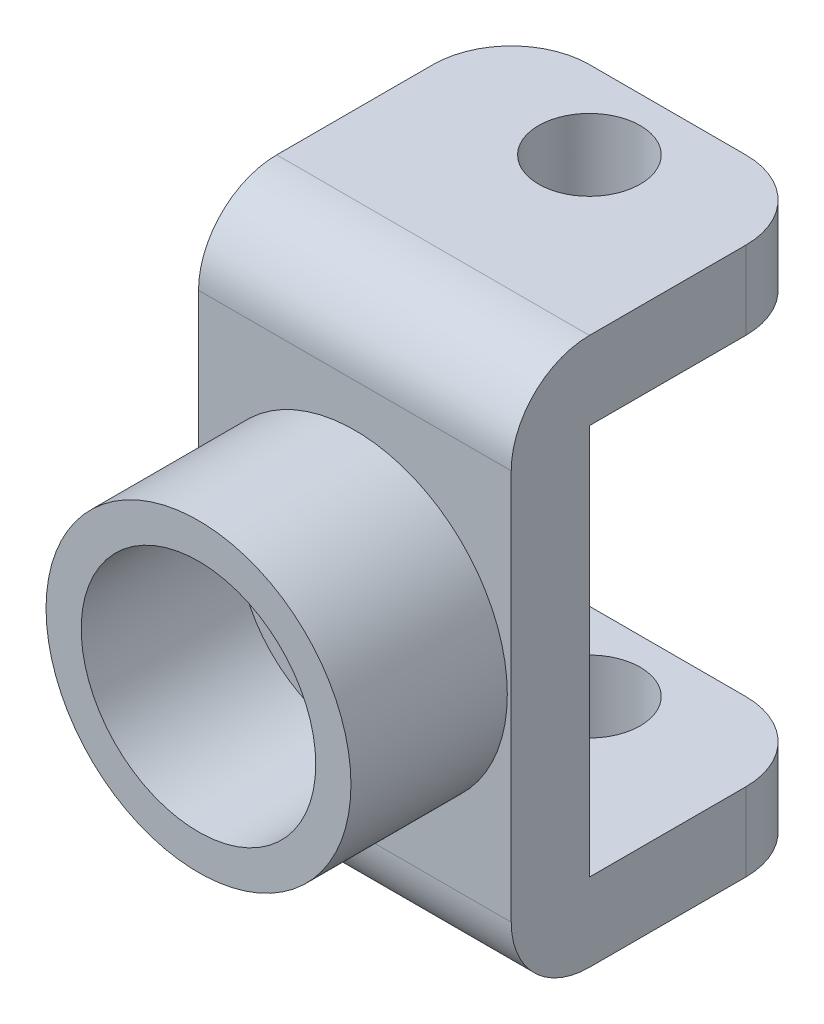
ISO-10303-21;
HEADER;
FILE_DESCRIPTION(('STEP AP214'),'2;1');
FILE_NAME('part.step','',(''),(''),'','','');
FILE_SCHEMA(('AUTOMOTIVE_DESIGN { 1 0 10303 214 1 1 1 1 }'));
ENDSEC;
DATA;
#1=APPLICATION_CONTEXT('core data for automotive mechanical design processes');
#2=APPLICATION_PROTOCOL_DEFINITION('international standard','automotive_design',2000,#1);
#3=PRODUCT_CONTEXT('',#1,'mechanical');
#4=PRODUCT('Part','Part','',(#3));
#5=PRODUCT_RELATED_PRODUCT_CATEGORY('part','',(#4));
#6=PRODUCT_DEFINITION_FORMATION('','',#4);
#7=PRODUCT_DEFINITION_CONTEXT('part definition',#1,'design');
#8=PRODUCT_DEFINITION('design','',#6,#7);
#9=PRODUCT_DEFINITION_SHAPE('','',#8);
#10=(LENGTH_UNIT() NAMED_UNIT(*) SI_UNIT(.MILLI.,.METRE.));
#11=(NAMED_UNIT(*) PLANE_ANGLE_UNIT() SI_UNIT($,.RADIAN.));
#12=(NAMED_UNIT(*) SI_UNIT($,.STERADIAN.) SOLID_ANGLE_UNIT());
#13=UNCERTAINTY_MEASURE_WITH_UNIT(LENGTH_MEASURE(1.E-05),#10,'distance_accuracy_value','');
#14=(GEOMETRIC_REPRESENTATION_CONTEXT(3) GLOBAL_UNCERTAINTY_ASSIGNED_CONTEXT((#13)) GLOBAL_UNIT_ASSIGNED_CONTEXT((#10,
#11,#12)) REPRESENTATION_CONTEXT('',''));
#15=CARTESIAN_POINT('',(0.,0.,0.));
#16=DIRECTION('',(0.,0.,1.));
#17=DIRECTION('',(1.,0.,0.));
#18=AXIS2_PLACEMENT_3D('',#15,#16,#17);
#19=CARTESIAN_POINT('',(0.,0.,0.));
#20=DIRECTION('',(0.,0.,1.));
#21=DIRECTION('',(1.,0.,0.));
#22=AXIS2_PLACEMENT_3D('',#19,#20,#21);
#23=PLANE('',#22);
#24=DIRECTION('',(1.,0.,0.));
#25=VECTOR('',#24,1.);
#26=CARTESIAN_POINT('',(0.,-25.,0.));
#27=LINE('',#26,#25);
#28=CARTESIAN_POINT('',(-20.,-25.,0.));
#29=VERTEX_POINT('',#28);
#30=CARTESIAN_POINT('',(20.,-25.,0.));
#31=VERTEX_POINT('',#30);
#32=EDGE_CURVE('E193',#29,#31,#27,.T.);
#33=ORIENTED_EDGE('',*,*,#32,.F.);
#34=DIRECTION('',(0.,1.,0.));
#35=VECTOR('',#34,1.);
#36=CARTESIAN_POINT('',(-20.,0.,0.));
#37=LINE('',#36,#35);
#38=CARTESIAN_POINT('',(-20.,25.,0.));
#39=VERTEX_POINT('',#38);
#40=EDGE_CURVE('E214',#29,#39,#37,.T.);
#41=ORIENTED_EDGE('',*,*,#40,.T.);
#42=DIRECTION('',(1.,0.,0.));
#43=VECTOR('',#42,1.);
#44=CARTESIAN_POINT('',(0.,25.,0.));
#45=LINE('',#44,#43);
#46=CARTESIAN_POINT('',(20.,25.,0.));
#47=VERTEX_POINT('',#46);
#48=EDGE_CURVE('E195',#39,#47,#45,.T.);
#49=ORIENTED_EDGE('',*,*,#48,.T.);
#50=DIRECTION('',(0.,1.,0.));
#51=VECTOR('',#50,1.);
#52=CARTESIAN_POINT('',(20.,0.,0.));
#53=LINE('',#52,#51);
#54=EDGE_CURVE('E179',#31,#47,#53,.T.);
#55=ORIENTED_EDGE('',*,*,#54,.F.);
#56=EDGE_LOOP('',(#33,#41,#49,#55));
#57=FACE_BOUND('',#56,.T.);
#58=ADVANCED_FACE('F69',(#57),#23,.F.);
#59=CARTESIAN_POINT('',(20.,0.,10.));
#60=DIRECTION('',(-1.,0.,0.));
#61=DIRECTION('',(0.,0.,1.));
#62=AXIS2_PLACEMENT_3D('',#59,#60,#61);
#63=PLANE('',#62);
#64=DIRECTION('',(0.,0.,1.));
#65=VECTOR('',#64,1.);
#66=CARTESIAN_POINT('',(20.,35.,10.));
#67=LINE('',#66,#65);
#68=CARTESIAN_POINT('',(20.,35.,-20.));
#69=VERTEX_POINT('',#68);
#70=CARTESIAN_POINT('',(20.,35.,0.));
#71=VERTEX_POINT('',#70);
#72=EDGE_CURVE('E303',#69,#71,#67,.T.);
#73=ORIENTED_EDGE('',*,*,#72,.T.);
#74=CARTESIAN_POINT('',(20.,25.,0.));
#75=DIRECTION('',(-1.,0.,0.));
#76=DIRECTION('',(0.,0.,1.));
#77=AXIS2_PLACEMENT_3D('',#74,#75,#76);
#78=CIRCLE('',#77,10.);
#79=CARTESIAN_POINT('',(20.,25.,10.));
#80=VERTEX_POINT('',#79);
#81=EDGE_CURVE('E255',#71,#80,#78,.F.);
#82=ORIENTED_EDGE('',*,*,#81,.T.);
#83=DIRECTION('',(0.,1.,0.));
#84=VECTOR('',#83,1.);
#85=CARTESIAN_POINT('',(20.,0.,10.));
#86=LINE('',#85,#84);
#87=CARTESIAN_POINT('',(20.,-25.,10.));
#88=VERTEX_POINT('',#87);
#89=EDGE_CURVE('E217',#88,#80,#86,.T.);
#90=ORIENTED_EDGE('',*,*,#89,.F.);
#91=CARTESIAN_POINT('',(20.,-25.,0.));
#92=DIRECTION('',(-1.,0.,0.));
#93=DIRECTION('',(0.,0.,1.));
#94=AXIS2_PLACEMENT_3D('',#91,#92,#93);
#95=CIRCLE('',#94,10.);
#96=CARTESIAN_POINT('',(20.,-35.,0.));
#97=VERTEX_POINT('',#96);
#98=EDGE_CURVE('E252',#88,#97,#95,.F.);
#99=ORIENTED_EDGE('',*,*,#98,.T.);
#100=DIRECTION('',(0.,0.,-1.));
#101=VECTOR('',#100,1.);
#102=CARTESIAN_POINT('',(20.,-35.,10.));
#103=LINE('',#102,#101);
#104=CARTESIAN_POINT('',(20.,-35.,-20.));
#105=VERTEX_POINT('',#104);
#106=EDGE_CURVE('E188',#97,#105,#103,.T.);
#107=ORIENTED_EDGE('',*,*,#106,.T.);
#108=DIRECTION('',(0.,1.,0.));
#109=VECTOR('',#108,1.);
#110=CARTESIAN_POINT('',(20.,0.,-20.));
#111=LINE('',#110,#109);
#112=CARTESIAN_POINT('',(20.,-25.,-20.));
#113=VERTEX_POINT('',#112);
#114=EDGE_CURVE('E183',#105,#113,#111,.T.);
#115=ORIENTED_EDGE('',*,*,#114,.T.);
#116=DIRECTION('',(0.,0.,1.));
#117=VECTOR('',#116,1.);
#118=CARTESIAN_POINT('',(20.,-25.,10.));
#119=LINE('',#118,#117);
#120=EDGE_CURVE('E174',#113,#31,#119,.T.);
#121=ORIENTED_EDGE('',*,*,#120,.T.);
#122=ORIENTED_EDGE('',*,*,#54,.T.);
#123=DIRECTION('',(0.,0.,-1.));
#124=VECTOR('',#123,1.);
#125=CARTESIAN_POINT('',(20.,25.,10.));
#126=LINE('',#125,#124);
#127=CARTESIAN_POINT('',(20.,25.,-20.));
#128=VERTEX_POINT('',#127);
#129=EDGE_CURVE('E299',#47,#128,#126,.T.);
#130=ORIENTED_EDGE('',*,*,#129,.T.);
#131=DIRECTION('',(0.,1.,0.));
#132=VECTOR('',#131,1.);
#133=CARTESIAN_POINT('',(20.,0.,-20.));
#134=LINE('',#133,#132);
#135=EDGE_CURVE('E246',#128,#69,#134,.T.);
#136=ORIENTED_EDGE('',*,*,#135,.T.);
#137=EDGE_LOOP('',(#73,#82,#90,#99,#107,#115,#121,#122,#130,#136));
#138=FACE_BOUND('',#137,.T.);
#139=ADVANCED_FACE('F177',(#138),#63,.F.);
#140=CARTESIAN_POINT('',(-20.,0.,10.));
#141=DIRECTION('',(-1.,0.,0.));
#142=DIRECTION('',(0.,0.,1.));
#143=AXIS2_PLACEMENT_3D('',#140,#141,#142);
#144=PLANE('',#143);
#145=DIRECTION('',(0.,1.,0.));
#146=VECTOR('',#145,1.);
#147=CARTESIAN_POINT('',(-20.,0.,10.));
#148=LINE('',#147,#146);
#149=CARTESIAN_POINT('',(-20.,-25.,10.));
#150=VERTEX_POINT('',#149);
#151=CARTESIAN_POINT('',(-20.,25.,10.));
#152=VERTEX_POINT('',#151);
#153=EDGE_CURVE('E209',#150,#152,#148,.T.);
#154=ORIENTED_EDGE('',*,*,#153,.T.);
#155=CARTESIAN_POINT('',(-20.,25.,0.));
#156=DIRECTION('',(-1.,0.,0.));
#157=DIRECTION('',(0.,0.,1.));
#158=AXIS2_PLACEMENT_3D('',#155,#156,#157);
#159=CIRCLE('',#158,10.);
#160=CARTESIAN_POINT('',(-20.,35.,0.));
#161=VERTEX_POINT('',#160);
#162=EDGE_CURVE('E234',#152,#161,#159,.T.);
#163=ORIENTED_EDGE('',*,*,#162,.T.);
#164=DIRECTION('',(0.,0.,1.));
#165=VECTOR('',#164,1.);
#166=CARTESIAN_POINT('',(-20.,35.,10.));
#167=LINE('',#166,#165);
#168=CARTESIAN_POINT('',(-20.,35.,-20.));
#169=VERTEX_POINT('',#168);
#170=EDGE_CURVE('E302',#169,#161,#167,.T.);
#171=ORIENTED_EDGE('',*,*,#170,.F.);
#172=DIRECTION('',(0.,1.,0.));
#173=VECTOR('',#172,1.);
#174=CARTESIAN_POINT('',(-20.,25.,-20.));
#175=LINE('',#174,#173);
#176=CARTESIAN_POINT('',(-20.,25.,-20.));
#177=VERTEX_POINT('',#176);
#178=EDGE_CURVE('E225',#169,#177,#175,.F.);
#179=ORIENTED_EDGE('',*,*,#178,.T.);
#180=DIRECTION('',(0.,0.,-1.));
#181=VECTOR('',#180,1.);
#182=CARTESIAN_POINT('',(-20.,25.,10.));
#183=LINE('',#182,#181);
#184=EDGE_CURVE('E307',#39,#177,#183,.T.);
#185=ORIENTED_EDGE('',*,*,#184,.F.);
#186=ORIENTED_EDGE('',*,*,#40,.F.);
#187=DIRECTION('',(0.,0.,1.));
#188=VECTOR('',#187,1.);
#189=CARTESIAN_POINT('',(-20.,-25.,10.));
#190=LINE('',#189,#188);
#191=CARTESIAN_POINT('',(-20.,-25.,-20.));
#192=VERTEX_POINT('',#191);
#193=EDGE_CURVE('E201',#192,#29,#190,.T.);
#194=ORIENTED_EDGE('',*,*,#193,.F.);
#195=DIRECTION('',(0.,1.,0.));
#196=VECTOR('',#195,1.);
#197=CARTESIAN_POINT('',(-20.,-35.,-20.));
#198=LINE('',#197,#196);
#199=CARTESIAN_POINT('',(-20.,-35.,-20.));
#200=VERTEX_POINT('',#199);
#201=EDGE_CURVE('E228',#192,#200,#198,.F.);
#202=ORIENTED_EDGE('',*,*,#201,.T.);
#203=DIRECTION('',(0.,0.,-1.));
#204=VECTOR('',#203,1.);
#205=CARTESIAN_POINT('',(-20.,-35.,10.));
#206=LINE('',#205,#204);
#207=CARTESIAN_POINT('',(-20.,-35.,0.));
#208=VERTEX_POINT('',#207);
#209=EDGE_CURVE('E310',#208,#200,#206,.T.);
#210=ORIENTED_EDGE('',*,*,#209,.F.);
#211=CARTESIAN_POINT('',(-20.,-25.,0.));
#212=DIRECTION('',(-1.,0.,0.));
#213=DIRECTION('',(0.,0.,1.));
#214=AXIS2_PLACEMENT_3D('',#211,#212,#213);
#215=CIRCLE('',#214,10.);
#216=EDGE_CURVE('E231',#208,#150,#215,.T.);
#217=ORIENTED_EDGE('',*,*,#216,.T.);
#218=EDGE_LOOP('',(#154,#163,#171,#179,#185,#186,#194,#202,#210,#217));
#219=FACE_BOUND('',#218,.T.);
#220=ADVANCED_FACE('F392',(#219),#144,.T.);
#221=CARTESIAN_POINT('',(0.,0.,10.));
#222=DIRECTION('',(0.,0.,1.));
#223=DIRECTION('',(1.,0.,0.));
#224=AXIS2_PLACEMENT_3D('',#221,#222,#223);
#225=PLANE('',#224);
#226=CARTESIAN_POINT('',(0.,0.,10.));
#227=DIRECTION('',(0.,0.,1.));
#228=DIRECTION('',(1.,0.,0.));
#229=AXIS2_PLACEMENT_3D('',#226,#227,#228);
#230=CIRCLE('',#229,19.5);
#231=CARTESIAN_POINT('',(19.5,0.,10.));
#232=VERTEX_POINT('',#231);
#233=EDGE_CURVE('E330',#232,#232,#230,.T.);
#234=ORIENTED_EDGE('',*,*,#233,.F.);
#235=EDGE_LOOP('',(#234));
#236=FACE_BOUND('',#235,.T.);
#237=ORIENTED_EDGE('',*,*,#89,.T.);
#238=DIRECTION('',(-1.,0.,0.));
#239=VECTOR('',#238,1.);
#240=CARTESIAN_POINT('',(-20.,25.,10.));
#241=LINE('',#240,#239);
#242=EDGE_CURVE('E221',#80,#152,#241,.T.);
#243=ORIENTED_EDGE('',*,*,#242,.T.);
#244=ORIENTED_EDGE('',*,*,#153,.F.);
#245=DIRECTION('',(-1.,0.,0.));
#246=VECTOR('',#245,1.);
#247=CARTESIAN_POINT('',(20.,-25.,10.));
#248=LINE('',#247,#246);
#249=EDGE_CURVE('E218',#150,#88,#248,.F.);
#250=ORIENTED_EDGE('',*,*,#249,.T.);
#251=EDGE_LOOP('',(#237,#243,#244,#250));
#252=FACE_BOUND('',#251,.T.);
#253=ADVANCED_FACE('F390',(#236,#252),#225,.T.);
#254=CARTESIAN_POINT('',(20.,-25.,10.));
#255=DIRECTION('',(0.,-1.,0.));
#256=DIRECTION('',(0.,0.,-1.));
#257=AXIS2_PLACEMENT_3D('',#254,#255,#256);
#258=PLANE('',#257);
#259=CARTESIAN_POINT('',(0.,-25.,-20.));
#260=DIRECTION('',(0.,-1.,0.));
#261=DIRECTION('',(0.,0.,-1.));
#262=AXIS2_PLACEMENT_3D('',#259,#260,#261);
#263=CIRCLE('',#262,6.5);
#264=CARTESIAN_POINT('',(0.,-25.,-26.5));
#265=VERTEX_POINT('',#264);
#266=EDGE_CURVE('E341',#265,#265,#263,.T.);
#267=ORIENTED_EDGE('',*,*,#266,.T.);
#268=EDGE_LOOP('',(#267));
#269=FACE_BOUND('',#268,.T.);
#270=DIRECTION('',(-1.,0.,0.));
#271=VECTOR('',#270,1.);
#272=CARTESIAN_POINT('',(20.,-25.,-30.));
#273=LINE('',#272,#271);
#274=CARTESIAN_POINT('',(10.,-25.,-30.));
#275=VERTEX_POINT('',#274);
#276=CARTESIAN_POINT('',(-10.,-25.,-30.));
#277=VERTEX_POINT('',#276);
#278=EDGE_CURVE('E187',#275,#277,#273,.T.);
#279=ORIENTED_EDGE('',*,*,#278,.T.);
#280=CARTESIAN_POINT('',(-10.,-25.,-20.));
#281=DIRECTION('',(0.,-1.,0.));
#282=DIRECTION('',(0.,0.,-1.));
#283=AXIS2_PLACEMENT_3D('',#280,#281,#282);
#284=CIRCLE('',#283,10.);
#285=EDGE_CURVE('E278',#277,#192,#284,.F.);
#286=ORIENTED_EDGE('',*,*,#285,.T.);
#287=ORIENTED_EDGE('',*,*,#193,.T.);
#288=ORIENTED_EDGE('',*,*,#32,.T.);
#289=ORIENTED_EDGE('',*,*,#120,.F.);
#290=CARTESIAN_POINT('',(10.,-25.,-20.));
#291=DIRECTION('',(0.,-1.,0.));
#292=DIRECTION('',(0.,0.,-1.));
#293=AXIS2_PLACEMENT_3D('',#290,#291,#292);
#294=CIRCLE('',#293,10.);
#295=EDGE_CURVE('E275',#113,#275,#294,.F.);
#296=ORIENTED_EDGE('',*,*,#295,.T.);
#297=EDGE_LOOP('',(#279,#286,#287,#288,#289,#296));
#298=FACE_BOUND('',#297,.T.);
#299=ADVANCED_FACE('F199',(#269,#298),#258,.F.);
#300=CARTESIAN_POINT('',(20.,-35.,10.));
#301=DIRECTION('',(0.,1.,0.));
#302=DIRECTION('',(0.,0.,1.));
#303=AXIS2_PLACEMENT_3D('',#300,#301,#302);
#304=PLANE('',#303);
#305=CARTESIAN_POINT('',(0.,-35.,-20.));
#306=DIRECTION('',(0.,-1.,0.));
#307=DIRECTION('',(0.,0.,-1.));
#308=AXIS2_PLACEMENT_3D('',#305,#306,#307);
#309=CIRCLE('',#308,6.5);
#310=CARTESIAN_POINT('',(0.,-35.,-26.5));
#311=VERTEX_POINT('',#310);
#312=EDGE_CURVE('E349',#311,#311,#309,.T.);
#313=ORIENTED_EDGE('',*,*,#312,.F.);
#314=EDGE_LOOP('',(#313));
#315=FACE_BOUND('',#314,.T.);
#316=ORIENTED_EDGE('',*,*,#106,.F.);
#317=DIRECTION('',(-1.,0.,0.));
#318=VECTOR('',#317,1.);
#319=CARTESIAN_POINT('',(-20.,-35.,0.));
#320=LINE('',#319,#318);
#321=EDGE_CURVE('E264',#97,#208,#320,.T.);
#322=ORIENTED_EDGE('',*,*,#321,.T.);
#323=ORIENTED_EDGE('',*,*,#209,.T.);
#324=CARTESIAN_POINT('',(-10.,-35.,-20.));
#325=DIRECTION('',(0.,1.,0.));
#326=DIRECTION('',(0.,0.,1.));
#327=AXIS2_PLACEMENT_3D('',#324,#325,#326);
#328=CIRCLE('',#327,10.);
#329=CARTESIAN_POINT('',(-10.,-35.,-30.));
#330=VERTEX_POINT('',#329);
#331=EDGE_CURVE('E261',#200,#330,#328,.F.);
#332=ORIENTED_EDGE('',*,*,#331,.T.);
#333=DIRECTION('',(-1.,0.,0.));
#334=VECTOR('',#333,1.);
#335=CARTESIAN_POINT('',(20.,-35.,-30.));
#336=LINE('',#335,#334);
#337=CARTESIAN_POINT('',(10.,-35.,-30.));
#338=VERTEX_POINT('',#337);
#339=EDGE_CURVE('E203',#338,#330,#336,.T.);
#340=ORIENTED_EDGE('',*,*,#339,.F.);
#341=CARTESIAN_POINT('',(10.,-35.,-20.));
#342=DIRECTION('',(0.,1.,0.));
#343=DIRECTION('',(0.,0.,1.));
#344=AXIS2_PLACEMENT_3D('',#341,#342,#343);
#345=CIRCLE('',#344,10.);
#346=EDGE_CURVE('E258',#338,#105,#345,.F.);
#347=ORIENTED_EDGE('',*,*,#346,.T.);
#348=EDGE_LOOP('',(#316,#322,#323,#332,#340,#347));
#349=FACE_BOUND('',#348,.T.);
#350=ADVANCED_FACE('F400',(#315,#349),#304,.F.);
#351=CARTESIAN_POINT('',(20.,-25.,-30.));
#352=DIRECTION('',(0.,0.,1.));
#353=DIRECTION('',(0.,-1.,0.));
#354=AXIS2_PLACEMENT_3D('',#351,#352,#353);
#355=PLANE('',#354);
#356=ORIENTED_EDGE('',*,*,#339,.T.);
#357=DIRECTION('',(0.,1.,0.));
#358=VECTOR('',#357,1.);
#359=CARTESIAN_POINT('',(-10.,-25.,-30.));
#360=LINE('',#359,#358);
#361=EDGE_CURVE('E271',#330,#277,#360,.T.);
#362=ORIENTED_EDGE('',*,*,#361,.T.);
#363=ORIENTED_EDGE('',*,*,#278,.F.);
#364=DIRECTION('',(0.,1.,0.));
#365=VECTOR('',#364,1.);
#366=CARTESIAN_POINT('',(10.,-25.,-30.));
#367=LINE('',#366,#365);
#368=EDGE_CURVE('E268',#275,#338,#367,.F.);
#369=ORIENTED_EDGE('',*,*,#368,.T.);
#370=EDGE_LOOP('',(#356,#362,#363,#369));
#371=FACE_BOUND('',#370,.T.);
#372=ADVANCED_FACE('F372',(#371),#355,.F.);
#373=CARTESIAN_POINT('',(20.,25.,10.));
#374=DIRECTION('',(0.,1.,0.));
#375=DIRECTION('',(0.,0.,1.));
#376=AXIS2_PLACEMENT_3D('',#373,#374,#375);
#377=PLANE('',#376);
#378=CARTESIAN_POINT('',(0.,25.,-20.));
#379=DIRECTION('',(0.,1.,0.));
#380=DIRECTION('',(0.,0.,1.));
#381=AXIS2_PLACEMENT_3D('',#378,#379,#380);
#382=CIRCLE('',#381,6.5);
#383=CARTESIAN_POINT('',(0.,25.,-13.5));
#384=VERTEX_POINT('',#383);
#385=EDGE_CURVE('E345',#384,#384,#382,.T.);
#386=ORIENTED_EDGE('',*,*,#385,.T.);
#387=EDGE_LOOP('',(#386));
#388=FACE_BOUND('',#387,.T.);
#389=ORIENTED_EDGE('',*,*,#184,.T.);
#390=CARTESIAN_POINT('',(-10.,25.,-20.));
#391=DIRECTION('',(0.,1.,0.));
#392=DIRECTION('',(0.,0.,1.));
#393=AXIS2_PLACEMENT_3D('',#390,#391,#392);
#394=CIRCLE('',#393,10.);
#395=CARTESIAN_POINT('',(-10.,25.,-30.));
#396=VERTEX_POINT('',#395);
#397=EDGE_CURVE('E79',#177,#396,#394,.F.);
#398=ORIENTED_EDGE('',*,*,#397,.T.);
#399=DIRECTION('',(-1.,0.,0.));
#400=VECTOR('',#399,1.);
#401=CARTESIAN_POINT('',(20.,25.,-30.));
#402=LINE('',#401,#400);
#403=CARTESIAN_POINT('',(10.,25.,-30.));
#404=VERTEX_POINT('',#403);
#405=EDGE_CURVE('E317',#404,#396,#402,.T.);
#406=ORIENTED_EDGE('',*,*,#405,.F.);
#407=CARTESIAN_POINT('',(10.,25.,-20.));
#408=DIRECTION('',(0.,1.,0.));
#409=DIRECTION('',(0.,0.,1.));
#410=AXIS2_PLACEMENT_3D('',#407,#408,#409);
#411=CIRCLE('',#410,10.);
#412=EDGE_CURVE('E287',#404,#128,#411,.F.);
#413=ORIENTED_EDGE('',*,*,#412,.T.);
#414=ORIENTED_EDGE('',*,*,#129,.F.);
#415=ORIENTED_EDGE('',*,*,#48,.F.);
#416=EDGE_LOOP('',(#389,#398,#406,#413,#414,#415));
#417=FACE_BOUND('',#416,.T.);
#418=ADVANCED_FACE('F369',(#388,#417),#377,.F.);
#419=CARTESIAN_POINT('',(20.,25.,-30.));
#420=DIRECTION('',(0.,0.,1.));
#421=DIRECTION('',(1.,0.,0.));
#422=AXIS2_PLACEMENT_3D('',#419,#420,#421);
#423=PLANE('',#422);
#424=ORIENTED_EDGE('',*,*,#405,.T.);
#425=DIRECTION('',(0.,1.,0.));
#426=VECTOR('',#425,1.);
#427=CARTESIAN_POINT('',(-10.,35.,-30.));
#428=LINE('',#427,#426);
#429=CARTESIAN_POINT('',(-10.,35.,-30.));
#430=VERTEX_POINT('',#429);
#431=EDGE_CURVE('E283',#396,#430,#428,.T.);
#432=ORIENTED_EDGE('',*,*,#431,.T.);
#433=DIRECTION('',(-1.,0.,0.));
#434=VECTOR('',#433,1.);
#435=CARTESIAN_POINT('',(20.,35.,-30.));
#436=LINE('',#435,#434);
#437=CARTESIAN_POINT('',(10.,35.,-30.));
#438=VERTEX_POINT('',#437);
#439=EDGE_CURVE('E306',#438,#430,#436,.T.);
#440=ORIENTED_EDGE('',*,*,#439,.F.);
#441=DIRECTION('',(0.,1.,0.));
#442=VECTOR('',#441,1.);
#443=CARTESIAN_POINT('',(10.,25.,-30.));
#444=LINE('',#443,#442);
#445=EDGE_CURVE('E92',#438,#404,#444,.F.);
#446=ORIENTED_EDGE('',*,*,#445,.T.);
#447=EDGE_LOOP('',(#424,#432,#440,#446));
#448=FACE_BOUND('',#447,.T.);
#449=ADVANCED_FACE('F371',(#448),#423,.F.);
#450=CARTESIAN_POINT('',(20.,35.,10.));
#451=DIRECTION('',(0.,-1.,0.));
#452=DIRECTION('',(0.,0.,-1.));
#453=AXIS2_PLACEMENT_3D('',#450,#451,#452);
#454=PLANE('',#453);
#455=CARTESIAN_POINT('',(0.,35.,-20.));
#456=DIRECTION('',(0.,-1.,0.));
#457=DIRECTION('',(0.,0.,-1.));
#458=AXIS2_PLACEMENT_3D('',#455,#456,#457);
#459=CIRCLE('',#458,6.5);
#460=CARTESIAN_POINT('',(0.,35.,-26.5));
#461=VERTEX_POINT('',#460);
#462=EDGE_CURVE('E73',#461,#461,#459,.T.);
#463=ORIENTED_EDGE('',*,*,#462,.T.);
#464=EDGE_LOOP('',(#463));
#465=FACE_BOUND('',#464,.T.);
#466=ORIENTED_EDGE('',*,*,#170,.T.);
#467=DIRECTION('',(-1.,0.,0.));
#468=VECTOR('',#467,1.);
#469=CARTESIAN_POINT('',(20.,35.,0.));
#470=LINE('',#469,#468);
#471=EDGE_CURVE('E243',#161,#71,#470,.F.);
#472=ORIENTED_EDGE('',*,*,#471,.T.);
#473=ORIENTED_EDGE('',*,*,#72,.F.);
#474=CARTESIAN_POINT('',(10.,35.,-20.));
#475=DIRECTION('',(0.,-1.,0.));
#476=DIRECTION('',(0.,0.,-1.));
#477=AXIS2_PLACEMENT_3D('',#474,#475,#476);
#478=CIRCLE('',#477,10.);
#479=EDGE_CURVE('E237',#69,#438,#478,.F.);
#480=ORIENTED_EDGE('',*,*,#479,.T.);
#481=ORIENTED_EDGE('',*,*,#439,.T.);
#482=CARTESIAN_POINT('',(-10.,35.,-20.));
#483=DIRECTION('',(0.,-1.,0.));
#484=DIRECTION('',(0.,0.,-1.));
#485=AXIS2_PLACEMENT_3D('',#482,#483,#484);
#486=CIRCLE('',#485,10.);
#487=EDGE_CURVE('E240',#430,#169,#486,.F.);
#488=ORIENTED_EDGE('',*,*,#487,.T.);
#489=EDGE_LOOP('',(#466,#472,#473,#480,#481,#488));
#490=FACE_BOUND('',#489,.T.);
#491=ADVANCED_FACE('F358',(#465,#490),#454,.F.);
#492=CARTESIAN_POINT('',(0.,25.,0.));
#493=DIRECTION('',(1.,0.,0.));
#494=DIRECTION('',(0.,0.,-1.));
#495=AXIS2_PLACEMENT_3D('',#492,#493,#494);
#496=CYLINDRICAL_SURFACE('',#495,10.);
#497=ORIENTED_EDGE('',*,*,#81,.F.);
#498=ORIENTED_EDGE('',*,*,#471,.F.);
#499=ORIENTED_EDGE('',*,*,#162,.F.);
#500=ORIENTED_EDGE('',*,*,#242,.F.);
#501=EDGE_LOOP('',(#497,#498,#499,#500));
#502=FACE_BOUND('',#501,.T.);
#503=ADVANCED_FACE('F388',(#502),#496,.T.);
#504=CARTESIAN_POINT('',(20.,-25.,0.));
#505=DIRECTION('',(1.,0.,0.));
#506=DIRECTION('',(0.,0.,-1.));
#507=AXIS2_PLACEMENT_3D('',#504,#505,#506);
#508=CYLINDRICAL_SURFACE('',#507,10.);
#509=ORIENTED_EDGE('',*,*,#98,.F.);
#510=ORIENTED_EDGE('',*,*,#249,.F.);
#511=ORIENTED_EDGE('',*,*,#216,.F.);
#512=ORIENTED_EDGE('',*,*,#321,.F.);
#513=EDGE_LOOP('',(#509,#510,#511,#512));
#514=FACE_BOUND('',#513,.T.);
#515=ADVANCED_FACE('F397',(#514),#508,.T.);
#516=CARTESIAN_POINT('',(-10.,-25.,-20.));
#517=DIRECTION('',(0.,-1.,0.));
#518=DIRECTION('',(0.,0.,-1.));
#519=AXIS2_PLACEMENT_3D('',#516,#517,#518);
#520=CYLINDRICAL_SURFACE('',#519,10.);
#521=ORIENTED_EDGE('',*,*,#331,.F.);
#522=ORIENTED_EDGE('',*,*,#201,.F.);
#523=ORIENTED_EDGE('',*,*,#285,.F.);
#524=ORIENTED_EDGE('',*,*,#361,.F.);
#525=EDGE_LOOP('',(#521,#522,#523,#524));
#526=FACE_BOUND('',#525,.T.);
#527=ADVANCED_FACE('F411',(#526),#520,.T.);
#528=CARTESIAN_POINT('',(10.,0.,-20.));
#529=DIRECTION('',(0.,1.,0.));
#530=DIRECTION('',(0.,0.,1.));
#531=AXIS2_PLACEMENT_3D('',#528,#529,#530);
#532=CYLINDRICAL_SURFACE('',#531,10.);
#533=ORIENTED_EDGE('',*,*,#346,.F.);
#534=ORIENTED_EDGE('',*,*,#368,.F.);
#535=ORIENTED_EDGE('',*,*,#295,.F.);
#536=ORIENTED_EDGE('',*,*,#114,.F.);
#537=EDGE_LOOP('',(#533,#534,#535,#536));
#538=FACE_BOUND('',#537,.T.);
#539=ADVANCED_FACE('F405',(#538),#532,.T.);
#540=CARTESIAN_POINT('',(-10.,25.,-20.));
#541=DIRECTION('',(0.,-1.,0.));
#542=DIRECTION('',(0.,0.,-1.));
#543=AXIS2_PLACEMENT_3D('',#540,#541,#542);
#544=CYLINDRICAL_SURFACE('',#543,10.);
#545=ORIENTED_EDGE('',*,*,#397,.F.);
#546=ORIENTED_EDGE('',*,*,#178,.F.);
#547=ORIENTED_EDGE('',*,*,#487,.F.);
#548=ORIENTED_EDGE('',*,*,#431,.F.);
#549=EDGE_LOOP('',(#545,#546,#547,#548));
#550=FACE_BOUND('',#549,.T.);
#551=ADVANCED_FACE('F379',(#550),#544,.T.);
#552=CARTESIAN_POINT('',(10.,0.,-20.));
#553=DIRECTION('',(0.,1.,0.));
#554=DIRECTION('',(0.,0.,1.));
#555=AXIS2_PLACEMENT_3D('',#552,#553,#554);
#556=CYLINDRICAL_SURFACE('',#555,10.);
#557=ORIENTED_EDGE('',*,*,#412,.F.);
#558=ORIENTED_EDGE('',*,*,#445,.F.);
#559=ORIENTED_EDGE('',*,*,#479,.F.);
#560=ORIENTED_EDGE('',*,*,#135,.F.);
#561=EDGE_LOOP('',(#557,#558,#559,#560));
#562=FACE_BOUND('',#561,.T.);
#563=ADVANCED_FACE('F71',(#562),#556,.T.);
#564=CARTESIAN_POINT('',(0.,0.,30.));
#565=DIRECTION('',(0.,0.,1.));
#566=DIRECTION('',(1.,0.,0.));
#567=AXIS2_PLACEMENT_3D('',#564,#565,#566);
#568=PLANE('',#567);
#569=CARTESIAN_POINT('',(0.,0.,30.));
#570=DIRECTION('',(0.,0.,1.));
#571=DIRECTION('',(1.,0.,0.));
#572=AXIS2_PLACEMENT_3D('',#569,#570,#571);
#573=CIRCLE('',#572,19.5);
#574=CARTESIAN_POINT('',(19.5,0.,30.));
#575=VERTEX_POINT('',#574);
#576=EDGE_CURVE('E319',#575,#575,#573,.T.);
#577=ORIENTED_EDGE('',*,*,#576,.T.);
#578=EDGE_LOOP('',(#577));
#579=FACE_BOUND('',#578,.T.);
#580=CARTESIAN_POINT('',(0.,0.,30.));
#581=DIRECTION('',(0.,0.,1.));
#582=DIRECTION('',(1.,0.,0.));
#583=AXIS2_PLACEMENT_3D('',#580,#581,#582);
#584=CIRCLE('',#583,15.);
#585=CARTESIAN_POINT('',(15.,0.,30.));
#586=VERTEX_POINT('',#585);
#587=EDGE_CURVE('E334',#586,#586,#584,.T.);
#588=ORIENTED_EDGE('',*,*,#587,.F.);
#589=EDGE_LOOP('',(#588));
#590=FACE_BOUND('',#589,.T.);
#591=ADVANCED_FACE('F453',(#579,#590),#568,.T.);
#592=CARTESIAN_POINT('',(0.,0.,30.));
#593=DIRECTION('',(0.,0.,-1.));
#594=DIRECTION('',(-1.,0.,0.));
#595=AXIS2_PLACEMENT_3D('',#592,#593,#594);
#596=CYLINDRICAL_SURFACE('',#595,19.5);
#597=ORIENTED_EDGE('',*,*,#576,.F.);
#598=EDGE_LOOP('',(#597));
#599=FACE_BOUND('',#598,.T.);
#600=ORIENTED_EDGE('',*,*,#233,.T.);
#601=EDGE_LOOP('',(#600));
#602=FACE_BOUND('',#601,.T.);
#603=ADVANCED_FACE('F449',(#599,#602),#596,.T.);
#604=CARTESIAN_POINT('',(0.,0.,30.));
#605=DIRECTION('',(0.,0.,-1.));
#606=DIRECTION('',(-1.,0.,0.));
#607=AXIS2_PLACEMENT_3D('',#604,#605,#606);
#608=CYLINDRICAL_SURFACE('',#607,15.);
#609=ORIENTED_EDGE('',*,*,#587,.T.);
#610=EDGE_LOOP('',(#609));
#611=FACE_BOUND('',#610,.T.);
#612=CARTESIAN_POINT('',(0.,0.,10.));
#613=DIRECTION('',(0.,0.,1.));
#614=DIRECTION('',(1.,0.,0.));
#615=AXIS2_PLACEMENT_3D('',#612,#613,#614);
#616=CIRCLE('',#615,15.);
#617=CARTESIAN_POINT('',(15.,0.,10.));
#618=VERTEX_POINT('',#617);
#619=EDGE_CURVE('E12',#618,#618,#616,.F.);
#620=ORIENTED_EDGE('',*,*,#619,.T.);
#621=EDGE_LOOP('',(#620));
#622=FACE_BOUND('',#621,.T.);
#623=ADVANCED_FACE('F452',(#611,#622),#608,.F.);
#624=ORIENTED_EDGE('',*,*,#619,.F.);
#625=EDGE_LOOP('',(#624));
#626=FACE_BOUND('',#625,.T.);
#627=ADVANCED_FACE('F365',(#626),#225,.T.);
#628=CARTESIAN_POINT('',(0.,65.,-20.));
#629=DIRECTION('',(0.,-1.,0.));
#630=DIRECTION('',(0.,0.,-1.));
#631=AXIS2_PLACEMENT_3D('',#628,#629,#630);
#632=CYLINDRICAL_SURFACE('',#631,6.5);
#633=ORIENTED_EDGE('',*,*,#462,.F.);
#634=EDGE_LOOP('',(#633));
#635=FACE_BOUND('',#634,.T.);
#636=ORIENTED_EDGE('',*,*,#385,.F.);
#637=EDGE_LOOP('',(#636));
#638=FACE_BOUND('',#637,.T.);
#639=ADVANCED_FACE('F361',(#635,#638),#632,.F.);
#640=ORIENTED_EDGE('',*,*,#312,.T.);
#641=EDGE_LOOP('',(#640));
#642=FACE_BOUND('',#641,.T.);
#643=ORIENTED_EDGE('',*,*,#266,.F.);
#644=EDGE_LOOP('',(#643));
#645=FACE_BOUND('',#644,.T.);
#646=ADVANCED_FACE('F364',(#642,#645),#632,.F.);
#647=CLOSED_SHELL('',(#58,#139,#220,#253,#299,#350,#372,#418,#449,#491,#503,#515,#527,#539,#551,
#563,#591,#603,#623,#627,#639,#646));
#648=MANIFOLD_SOLID_BREP('B2',#647);
#649=ADVANCED_BREP_SHAPE_REPRESENTATION('',(#18,#648),#14);
#650=SHAPE_DEFINITION_REPRESENTATION(#9,#649);
ENDSEC;
END-ISO-10303-21;
